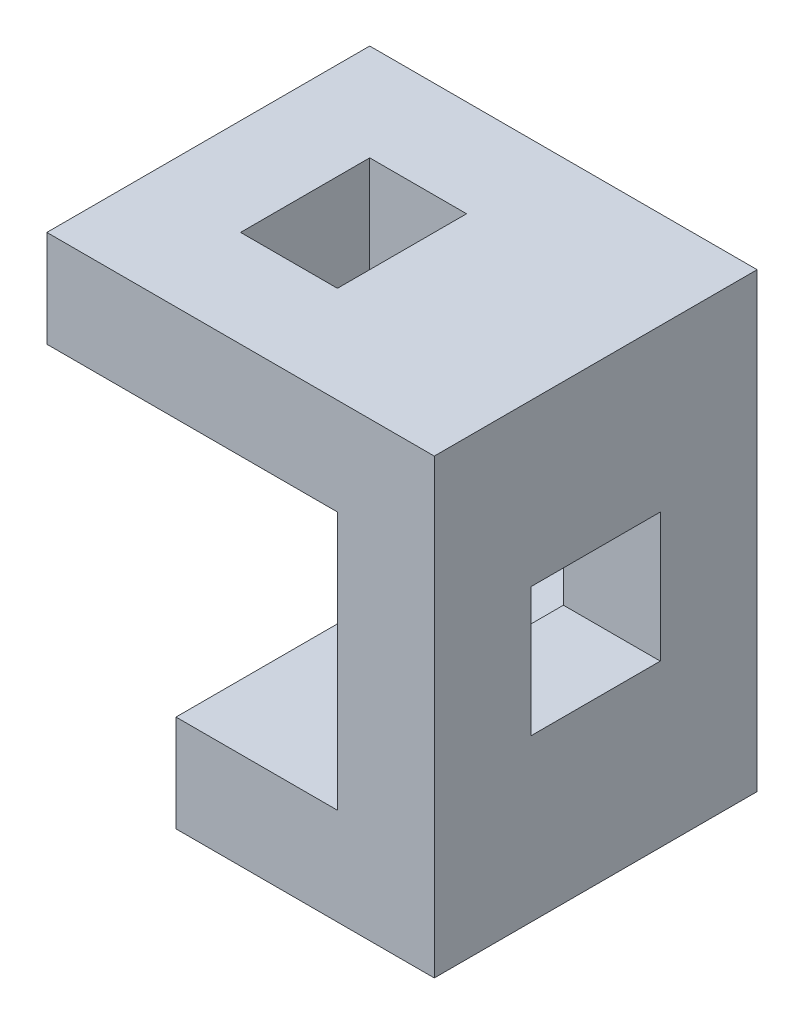
ISO-10303-21;
HEADER;
FILE_DESCRIPTION(('STEP AP214'),'2;1');
FILE_NAME('part.step','',(''),(''),'','','');
FILE_SCHEMA(('AUTOMOTIVE_DESIGN { 1 0 10303 214 1 1 1 1 }'));
ENDSEC;
DATA;
#1=APPLICATION_CONTEXT('core data for automotive mechanical design processes');
#2=APPLICATION_PROTOCOL_DEFINITION('international standard','automotive_design',2000,#1);
#3=PRODUCT_CONTEXT('',#1,'mechanical');
#4=PRODUCT('Part','Part','',(#3));
#5=PRODUCT_RELATED_PRODUCT_CATEGORY('part','',(#4));
#6=PRODUCT_DEFINITION_FORMATION('','',#4);
#7=PRODUCT_DEFINITION_CONTEXT('part definition',#1,'design');
#8=PRODUCT_DEFINITION('design','',#6,#7);
#9=PRODUCT_DEFINITION_SHAPE('','',#8);
#10=(LENGTH_UNIT() NAMED_UNIT(*) SI_UNIT(.MILLI.,.METRE.));
#11=(NAMED_UNIT(*) PLANE_ANGLE_UNIT() SI_UNIT($,.RADIAN.));
#12=(NAMED_UNIT(*) SI_UNIT($,.STERADIAN.) SOLID_ANGLE_UNIT());
#13=UNCERTAINTY_MEASURE_WITH_UNIT(LENGTH_MEASURE(1.E-05),#10,'distance_accuracy_value','');
#14=(GEOMETRIC_REPRESENTATION_CONTEXT(3) GLOBAL_UNCERTAINTY_ASSIGNED_CONTEXT((#13)) GLOBAL_UNIT_ASSIGNED_CONTEXT((#10,
#11,#12)) REPRESENTATION_CONTEXT('',''));
#15=CARTESIAN_POINT('',(0.,0.,0.));
#16=DIRECTION('',(0.,0.,1.));
#17=DIRECTION('',(1.,0.,0.));
#18=AXIS2_PLACEMENT_3D('',#15,#16,#17);
#19=CARTESIAN_POINT('',(-60.,-15.,50.));
#20=DIRECTION('',(1.,0.,0.));
#21=DIRECTION('',(0.,0.,-1.));
#22=AXIS2_PLACEMENT_3D('',#19,#20,#21);
#23=PLANE('',#22);
#24=DIRECTION('',(0.,-1.,0.));
#25=VECTOR('',#24,1.);
#26=CARTESIAN_POINT('',(-60.,-15.,0.));
#27=LINE('',#26,#25);
#28=CARTESIAN_POINT('',(-60.,0.,0.));
#29=VERTEX_POINT('',#28);
#30=CARTESIAN_POINT('',(-60.,-15.,0.));
#31=VERTEX_POINT('',#30);
#32=EDGE_CURVE('E196',#29,#31,#27,.T.);
#33=ORIENTED_EDGE('',*,*,#32,.T.);
#34=DIRECTION('',(0.,0.,-1.));
#35=VECTOR('',#34,1.);
#36=CARTESIAN_POINT('',(-60.,-15.,50.));
#37=LINE('',#36,#35);
#38=CARTESIAN_POINT('',(-60.,-15.,50.));
#39=VERTEX_POINT('',#38);
#40=EDGE_CURVE('E257',#39,#31,#37,.T.);
#41=ORIENTED_EDGE('',*,*,#40,.F.);
#42=DIRECTION('',(0.,-1.,0.));
#43=VECTOR('',#42,1.);
#44=CARTESIAN_POINT('',(-60.,-15.,50.));
#45=LINE('',#44,#43);
#46=CARTESIAN_POINT('',(-60.,0.,50.));
#47=VERTEX_POINT('',#46);
#48=EDGE_CURVE('E203',#47,#39,#45,.T.);
#49=ORIENTED_EDGE('',*,*,#48,.F.);
#50=DIRECTION('',(0.,0.,-1.));
#51=VECTOR('',#50,1.);
#52=CARTESIAN_POINT('',(-60.,0.,50.));
#53=LINE('',#52,#51);
#54=EDGE_CURVE('E221',#47,#29,#53,.T.);
#55=ORIENTED_EDGE('',*,*,#54,.T.);
#56=EDGE_LOOP('',(#33,#41,#49,#55));
#57=FACE_BOUND('',#56,.T.);
#58=ADVANCED_FACE('F33',(#57),#23,.F.);
#59=CARTESIAN_POINT('',(-15.,-15.,50.));
#60=DIRECTION('',(0.,1.,0.));
#61=DIRECTION('',(-1.,0.,0.));
#62=AXIS2_PLACEMENT_3D('',#59,#60,#61);
#63=PLANE('',#62);
#64=DIRECTION('',(0.,0.,-1.));
#65=VECTOR('',#64,1.);
#66=CARTESIAN_POINT('',(-30.,-15.,50.));
#67=LINE('',#66,#65);
#68=CARTESIAN_POINT('',(-30.,-15.,35.));
#69=VERTEX_POINT('',#68);
#70=CARTESIAN_POINT('',(-30.,-15.,15.));
#71=VERTEX_POINT('',#70);
#72=EDGE_CURVE('E176',#69,#71,#67,.T.);
#73=ORIENTED_EDGE('',*,*,#72,.T.);
#74=DIRECTION('',(-1.,0.,0.));
#75=VECTOR('',#74,1.);
#76=CARTESIAN_POINT('',(-15.,-15.,15.));
#77=LINE('',#76,#75);
#78=CARTESIAN_POINT('',(-45.,-15.,15.));
#79=VERTEX_POINT('',#78);
#80=EDGE_CURVE('E179',#71,#79,#77,.T.);
#81=ORIENTED_EDGE('',*,*,#80,.T.);
#82=DIRECTION('',(0.,0.,1.));
#83=VECTOR('',#82,1.);
#84=CARTESIAN_POINT('',(-45.,-15.,50.));
#85=LINE('',#84,#83);
#86=CARTESIAN_POINT('',(-45.,-15.,35.));
#87=VERTEX_POINT('',#86);
#88=EDGE_CURVE('E171',#79,#87,#85,.T.);
#89=ORIENTED_EDGE('',*,*,#88,.T.);
#90=DIRECTION('',(1.,0.,0.));
#91=VECTOR('',#90,1.);
#92=CARTESIAN_POINT('',(-15.,-15.,35.));
#93=LINE('',#92,#91);
#94=EDGE_CURVE('E151',#87,#69,#93,.T.);
#95=ORIENTED_EDGE('',*,*,#94,.T.);
#96=EDGE_LOOP('',(#73,#81,#89,#95));
#97=FACE_BOUND('',#96,.T.);
#98=DIRECTION('',(1.,0.,0.));
#99=VECTOR('',#98,1.);
#100=CARTESIAN_POINT('',(-15.,-15.,0.));
#101=LINE('',#100,#99);
#102=CARTESIAN_POINT('',(-15.,-15.,0.));
#103=VERTEX_POINT('',#102);
#104=EDGE_CURVE('E224',#31,#103,#101,.T.);
#105=ORIENTED_EDGE('',*,*,#104,.T.);
#106=DIRECTION('',(0.,0.,-1.));
#107=VECTOR('',#106,1.);
#108=CARTESIAN_POINT('',(-15.,-15.,50.));
#109=LINE('',#108,#107);
#110=CARTESIAN_POINT('',(-15.,-15.,50.));
#111=VERTEX_POINT('',#110);
#112=EDGE_CURVE('E254',#111,#103,#109,.T.);
#113=ORIENTED_EDGE('',*,*,#112,.F.);
#114=DIRECTION('',(1.,0.,0.));
#115=VECTOR('',#114,1.);
#116=CARTESIAN_POINT('',(-15.,-15.,50.));
#117=LINE('',#116,#115);
#118=EDGE_CURVE('E206',#39,#111,#117,.T.);
#119=ORIENTED_EDGE('',*,*,#118,.F.);
#120=ORIENTED_EDGE('',*,*,#40,.T.);
#121=EDGE_LOOP('',(#105,#113,#119,#120));
#122=FACE_BOUND('',#121,.T.);
#123=ADVANCED_FACE('F300',(#97,#122),#63,.F.);
#124=CARTESIAN_POINT('',(-15.,-55.,50.));
#125=DIRECTION('',(1.,0.,0.));
#126=DIRECTION('',(0.,1.,0.));
#127=AXIS2_PLACEMENT_3D('',#124,#125,#126);
#128=PLANE('',#127);
#129=DIRECTION('',(0.,-1.,0.));
#130=VECTOR('',#129,1.);
#131=CARTESIAN_POINT('',(-15.,-25.,15.));
#132=LINE('',#131,#130);
#133=CARTESIAN_POINT('',(-15.,-25.,15.));
#134=VERTEX_POINT('',#133);
#135=CARTESIAN_POINT('',(-15.,-45.,15.));
#136=VERTEX_POINT('',#135);
#137=EDGE_CURVE('E184',#134,#136,#132,.T.);
#138=ORIENTED_EDGE('',*,*,#137,.F.);
#139=DIRECTION('',(0.,0.,-1.));
#140=VECTOR('',#139,1.);
#141=CARTESIAN_POINT('',(-15.,-25.,35.));
#142=LINE('',#141,#140);
#143=CARTESIAN_POINT('',(-15.,-25.,35.));
#144=VERTEX_POINT('',#143);
#145=EDGE_CURVE('E182',#144,#134,#142,.T.);
#146=ORIENTED_EDGE('',*,*,#145,.F.);
#147=DIRECTION('',(0.,1.,0.));
#148=VECTOR('',#147,1.);
#149=CARTESIAN_POINT('',(-15.,-45.,35.));
#150=LINE('',#149,#148);
#151=CARTESIAN_POINT('',(-15.,-45.,35.));
#152=VERTEX_POINT('',#151);
#153=EDGE_CURVE('E190',#152,#144,#150,.T.);
#154=ORIENTED_EDGE('',*,*,#153,.F.);
#155=DIRECTION('',(0.,0.,1.));
#156=VECTOR('',#155,1.);
#157=CARTESIAN_POINT('',(-15.,-45.,15.));
#158=LINE('',#157,#156);
#159=EDGE_CURVE('E187',#136,#152,#158,.T.);
#160=ORIENTED_EDGE('',*,*,#159,.F.);
#161=EDGE_LOOP('',(#138,#146,#154,#160));
#162=FACE_BOUND('',#161,.T.);
#163=DIRECTION('',(0.,-1.,0.));
#164=VECTOR('',#163,1.);
#165=CARTESIAN_POINT('',(-15.,-55.,0.));
#166=LINE('',#165,#164);
#167=CARTESIAN_POINT('',(-15.,-55.,0.));
#168=VERTEX_POINT('',#167);
#169=EDGE_CURVE('E226',#103,#168,#166,.T.);
#170=ORIENTED_EDGE('',*,*,#169,.T.);
#171=DIRECTION('',(0.,0.,-1.));
#172=VECTOR('',#171,1.);
#173=CARTESIAN_POINT('',(-15.,-55.,50.));
#174=LINE('',#173,#172);
#175=CARTESIAN_POINT('',(-15.,-55.,50.));
#176=VERTEX_POINT('',#175);
#177=EDGE_CURVE('E251',#176,#168,#174,.T.);
#178=ORIENTED_EDGE('',*,*,#177,.F.);
#179=DIRECTION('',(0.,-1.,0.));
#180=VECTOR('',#179,1.);
#181=CARTESIAN_POINT('',(-15.,-55.,50.));
#182=LINE('',#181,#180);
#183=EDGE_CURVE('E209',#111,#176,#182,.T.);
#184=ORIENTED_EDGE('',*,*,#183,.F.);
#185=ORIENTED_EDGE('',*,*,#112,.T.);
#186=EDGE_LOOP('',(#170,#178,#184,#185));
#187=FACE_BOUND('',#186,.T.);
#188=ADVANCED_FACE('F281',(#162,#187),#128,.F.);
#189=CARTESIAN_POINT('',(-40.,-55.,50.));
#190=DIRECTION('',(0.,-1.,0.));
#191=DIRECTION('',(0.,0.,-1.));
#192=AXIS2_PLACEMENT_3D('',#189,#190,#191);
#193=PLANE('',#192);
#194=DIRECTION('',(-1.,0.,0.));
#195=VECTOR('',#194,1.);
#196=CARTESIAN_POINT('',(-40.,-55.,0.));
#197=LINE('',#196,#195);
#198=CARTESIAN_POINT('',(-40.,-55.,0.));
#199=VERTEX_POINT('',#198);
#200=EDGE_CURVE('E228',#168,#199,#197,.T.);
#201=ORIENTED_EDGE('',*,*,#200,.T.);
#202=DIRECTION('',(0.,0.,-1.));
#203=VECTOR('',#202,1.);
#204=CARTESIAN_POINT('',(-40.,-55.,50.));
#205=LINE('',#204,#203);
#206=CARTESIAN_POINT('',(-40.,-55.,50.));
#207=VERTEX_POINT('',#206);
#208=EDGE_CURVE('E248',#207,#199,#205,.T.);
#209=ORIENTED_EDGE('',*,*,#208,.F.);
#210=DIRECTION('',(-1.,0.,0.));
#211=VECTOR('',#210,1.);
#212=CARTESIAN_POINT('',(-40.,-55.,50.));
#213=LINE('',#212,#211);
#214=EDGE_CURVE('E211',#176,#207,#213,.T.);
#215=ORIENTED_EDGE('',*,*,#214,.F.);
#216=ORIENTED_EDGE('',*,*,#177,.T.);
#217=EDGE_LOOP('',(#201,#209,#215,#216));
#218=FACE_BOUND('',#217,.T.);
#219=ADVANCED_FACE('F337',(#218),#193,.F.);
#220=CARTESIAN_POINT('',(-40.,-70.,50.));
#221=DIRECTION('',(1.,0.,0.));
#222=DIRECTION('',(0.,1.,0.));
#223=AXIS2_PLACEMENT_3D('',#220,#221,#222);
#224=PLANE('',#223);
#225=DIRECTION('',(0.,-1.,0.));
#226=VECTOR('',#225,1.);
#227=CARTESIAN_POINT('',(-40.,-70.,0.));
#228=LINE('',#227,#226);
#229=CARTESIAN_POINT('',(-40.,-70.,0.));
#230=VERTEX_POINT('',#229);
#231=EDGE_CURVE('E230',#199,#230,#228,.T.);
#232=ORIENTED_EDGE('',*,*,#231,.T.);
#233=DIRECTION('',(0.,0.,-1.));
#234=VECTOR('',#233,1.);
#235=CARTESIAN_POINT('',(-40.,-70.,50.));
#236=LINE('',#235,#234);
#237=CARTESIAN_POINT('',(-40.,-70.,50.));
#238=VERTEX_POINT('',#237);
#239=EDGE_CURVE('E245',#238,#230,#236,.T.);
#240=ORIENTED_EDGE('',*,*,#239,.F.);
#241=DIRECTION('',(0.,-1.,0.));
#242=VECTOR('',#241,1.);
#243=CARTESIAN_POINT('',(-40.,-70.,50.));
#244=LINE('',#243,#242);
#245=EDGE_CURVE('E213',#207,#238,#244,.T.);
#246=ORIENTED_EDGE('',*,*,#245,.F.);
#247=ORIENTED_EDGE('',*,*,#208,.T.);
#248=EDGE_LOOP('',(#232,#240,#246,#247));
#249=FACE_BOUND('',#248,.T.);
#250=ADVANCED_FACE('F333',(#249),#224,.F.);
#251=CARTESIAN_POINT('',(0.,-70.,50.));
#252=DIRECTION('',(0.,1.,0.));
#253=DIRECTION('',(-1.,0.,0.));
#254=AXIS2_PLACEMENT_3D('',#251,#252,#253);
#255=PLANE('',#254);
#256=DIRECTION('',(1.,0.,0.));
#257=VECTOR('',#256,1.);
#258=CARTESIAN_POINT('',(0.,-70.,0.));
#259=LINE('',#258,#257);
#260=CARTESIAN_POINT('',(0.,-70.,0.));
#261=VERTEX_POINT('',#260);
#262=EDGE_CURVE('E232',#230,#261,#259,.T.);
#263=ORIENTED_EDGE('',*,*,#262,.T.);
#264=DIRECTION('',(0.,0.,-1.));
#265=VECTOR('',#264,1.);
#266=CARTESIAN_POINT('',(0.,-70.,50.));
#267=LINE('',#266,#265);
#268=CARTESIAN_POINT('',(0.,-70.,50.));
#269=VERTEX_POINT('',#268);
#270=EDGE_CURVE('E242',#269,#261,#267,.T.);
#271=ORIENTED_EDGE('',*,*,#270,.F.);
#272=DIRECTION('',(1.,0.,0.));
#273=VECTOR('',#272,1.);
#274=CARTESIAN_POINT('',(0.,-70.,50.));
#275=LINE('',#274,#273);
#276=EDGE_CURVE('E215',#238,#269,#275,.T.);
#277=ORIENTED_EDGE('',*,*,#276,.F.);
#278=ORIENTED_EDGE('',*,*,#239,.T.);
#279=EDGE_LOOP('',(#263,#271,#277,#278));
#280=FACE_BOUND('',#279,.T.);
#281=ADVANCED_FACE('F328',(#280),#255,.F.);
#282=CARTESIAN_POINT('',(0.,0.,50.));
#283=DIRECTION('',(-1.,0.,0.));
#284=DIRECTION('',(0.,-1.,0.));
#285=AXIS2_PLACEMENT_3D('',#282,#283,#284);
#286=PLANE('',#285);
#287=DIRECTION('',(0.,1.,0.));
#288=VECTOR('',#287,1.);
#289=CARTESIAN_POINT('',(0.,0.,35.));
#290=LINE('',#289,#288);
#291=CARTESIAN_POINT('',(0.,-45.,35.));
#292=VERTEX_POINT('',#291);
#293=CARTESIAN_POINT('',(0.,-25.,35.));
#294=VERTEX_POINT('',#293);
#295=EDGE_CURVE('E40',#292,#294,#290,.T.);
#296=ORIENTED_EDGE('',*,*,#295,.T.);
#297=DIRECTION('',(0.,0.,-1.));
#298=VECTOR('',#297,1.);
#299=CARTESIAN_POINT('',(0.,-25.,50.));
#300=LINE('',#299,#298);
#301=CARTESIAN_POINT('',(0.,-25.,15.));
#302=VERTEX_POINT('',#301);
#303=EDGE_CURVE('E11',#294,#302,#300,.T.);
#304=ORIENTED_EDGE('',*,*,#303,.T.);
#305=DIRECTION('',(0.,-1.,0.));
#306=VECTOR('',#305,1.);
#307=CARTESIAN_POINT('',(0.,0.,15.));
#308=LINE('',#307,#306);
#309=CARTESIAN_POINT('',(0.,-45.,15.));
#310=VERTEX_POINT('',#309);
#311=EDGE_CURVE('E260',#302,#310,#308,.T.);
#312=ORIENTED_EDGE('',*,*,#311,.T.);
#313=DIRECTION('',(0.,0.,1.));
#314=VECTOR('',#313,1.);
#315=CARTESIAN_POINT('',(0.,-45.,50.));
#316=LINE('',#315,#314);
#317=EDGE_CURVE('E263',#310,#292,#316,.T.);
#318=ORIENTED_EDGE('',*,*,#317,.T.);
#319=EDGE_LOOP('',(#296,#304,#312,#318));
#320=FACE_BOUND('',#319,.T.);
#321=DIRECTION('',(0.,1.,0.));
#322=VECTOR('',#321,1.);
#323=CARTESIAN_POINT('',(0.,0.,0.));
#324=LINE('',#323,#322);
#325=CARTESIAN_POINT('',(0.,0.,0.));
#326=VERTEX_POINT('',#325);
#327=EDGE_CURVE('E234',#261,#326,#324,.T.);
#328=ORIENTED_EDGE('',*,*,#327,.T.);
#329=DIRECTION('',(0.,0.,-1.));
#330=VECTOR('',#329,1.);
#331=CARTESIAN_POINT('',(0.,0.,50.));
#332=LINE('',#331,#330);
#333=CARTESIAN_POINT('',(0.,0.,50.));
#334=VERTEX_POINT('',#333);
#335=EDGE_CURVE('E239',#334,#326,#332,.T.);
#336=ORIENTED_EDGE('',*,*,#335,.F.);
#337=DIRECTION('',(0.,1.,0.));
#338=VECTOR('',#337,1.);
#339=CARTESIAN_POINT('',(0.,0.,50.));
#340=LINE('',#339,#338);
#341=EDGE_CURVE('E217',#269,#334,#340,.T.);
#342=ORIENTED_EDGE('',*,*,#341,.F.);
#343=ORIENTED_EDGE('',*,*,#270,.T.);
#344=EDGE_LOOP('',(#328,#336,#342,#343));
#345=FACE_BOUND('',#344,.T.);
#346=ADVANCED_FACE('F267',(#320,#345),#286,.F.);
#347=CARTESIAN_POINT('',(-60.,0.,50.));
#348=DIRECTION('',(0.,-1.,0.));
#349=DIRECTION('',(0.,0.,-1.));
#350=AXIS2_PLACEMENT_3D('',#347,#348,#349);
#351=PLANE('',#350);
#352=DIRECTION('',(0.,0.,1.));
#353=VECTOR('',#352,1.);
#354=CARTESIAN_POINT('',(-45.,0.,15.));
#355=LINE('',#354,#353);
#356=CARTESIAN_POINT('',(-45.,0.,15.));
#357=VERTEX_POINT('',#356);
#358=CARTESIAN_POINT('',(-45.,0.,35.));
#359=VERTEX_POINT('',#358);
#360=EDGE_CURVE('E157',#357,#359,#355,.T.);
#361=ORIENTED_EDGE('',*,*,#360,.F.);
#362=DIRECTION('',(-1.,0.,0.));
#363=VECTOR('',#362,1.);
#364=CARTESIAN_POINT('',(-30.,0.,15.));
#365=LINE('',#364,#363);
#366=CARTESIAN_POINT('',(-30.,0.,15.));
#367=VERTEX_POINT('',#366);
#368=EDGE_CURVE('E55',#367,#357,#365,.T.);
#369=ORIENTED_EDGE('',*,*,#368,.F.);
#370=DIRECTION('',(0.,0.,-1.));
#371=VECTOR('',#370,1.);
#372=CARTESIAN_POINT('',(-30.,0.,35.));
#373=LINE('',#372,#371);
#374=CARTESIAN_POINT('',(-30.,0.,35.));
#375=VERTEX_POINT('',#374);
#376=EDGE_CURVE('E164',#375,#367,#373,.T.);
#377=ORIENTED_EDGE('',*,*,#376,.F.);
#378=DIRECTION('',(1.,0.,0.));
#379=VECTOR('',#378,1.);
#380=CARTESIAN_POINT('',(-45.,0.,35.));
#381=LINE('',#380,#379);
#382=EDGE_CURVE('E148',#359,#375,#381,.T.);
#383=ORIENTED_EDGE('',*,*,#382,.F.);
#384=EDGE_LOOP('',(#361,#369,#377,#383));
#385=FACE_BOUND('',#384,.T.);
#386=DIRECTION('',(-1.,0.,0.));
#387=VECTOR('',#386,1.);
#388=CARTESIAN_POINT('',(-60.,0.,0.));
#389=LINE('',#388,#387);
#390=EDGE_CURVE('E207',#326,#29,#389,.T.);
#391=ORIENTED_EDGE('',*,*,#390,.T.);
#392=ORIENTED_EDGE('',*,*,#54,.F.);
#393=DIRECTION('',(-1.,0.,0.));
#394=VECTOR('',#393,1.);
#395=CARTESIAN_POINT('',(-60.,0.,50.));
#396=LINE('',#395,#394);
#397=EDGE_CURVE('E219',#334,#47,#396,.T.);
#398=ORIENTED_EDGE('',*,*,#397,.F.);
#399=ORIENTED_EDGE('',*,*,#335,.T.);
#400=EDGE_LOOP('',(#391,#392,#398,#399));
#401=FACE_BOUND('',#400,.T.);
#402=ADVANCED_FACE('F161',(#385,#401),#351,.F.);
#403=CARTESIAN_POINT('',(0.,0.,50.));
#404=DIRECTION('',(0.,0.,-1.));
#405=DIRECTION('',(-1.,0.,0.));
#406=AXIS2_PLACEMENT_3D('',#403,#404,#405);
#407=PLANE('',#406);
#408=ORIENTED_EDGE('',*,*,#48,.T.);
#409=ORIENTED_EDGE('',*,*,#118,.T.);
#410=ORIENTED_EDGE('',*,*,#183,.T.);
#411=ORIENTED_EDGE('',*,*,#214,.T.);
#412=ORIENTED_EDGE('',*,*,#245,.T.);
#413=ORIENTED_EDGE('',*,*,#276,.T.);
#414=ORIENTED_EDGE('',*,*,#341,.T.);
#415=ORIENTED_EDGE('',*,*,#397,.T.);
#416=EDGE_LOOP('',(#408,#409,#410,#411,#412,#413,#414,#415));
#417=FACE_BOUND('',#416,.T.);
#418=ADVANCED_FACE('F320',(#417),#407,.F.);
#419=CARTESIAN_POINT('',(0.,0.,0.));
#420=DIRECTION('',(0.,0.,-1.));
#421=DIRECTION('',(-1.,0.,0.));
#422=AXIS2_PLACEMENT_3D('',#419,#420,#421);
#423=PLANE('',#422);
#424=ORIENTED_EDGE('',*,*,#32,.F.);
#425=ORIENTED_EDGE('',*,*,#390,.F.);
#426=ORIENTED_EDGE('',*,*,#327,.F.);
#427=ORIENTED_EDGE('',*,*,#262,.F.);
#428=ORIENTED_EDGE('',*,*,#231,.F.);
#429=ORIENTED_EDGE('',*,*,#200,.F.);
#430=ORIENTED_EDGE('',*,*,#169,.F.);
#431=ORIENTED_EDGE('',*,*,#104,.F.);
#432=EDGE_LOOP('',(#424,#425,#426,#427,#428,#429,#430,#431));
#433=FACE_BOUND('',#432,.T.);
#434=ADVANCED_FACE('F312',(#433),#423,.T.);
#435=CARTESIAN_POINT('',(35.,-25.,35.));
#436=DIRECTION('',(0.,1.,0.));
#437=DIRECTION('',(-1.,0.,0.));
#438=AXIS2_PLACEMENT_3D('',#435,#436,#437);
#439=PLANE('',#438);
#440=DIRECTION('',(-1.,0.,0.));
#441=VECTOR('',#440,1.);
#442=CARTESIAN_POINT('',(35.,-25.,35.));
#443=LINE('',#442,#441);
#444=EDGE_CURVE('E194',#294,#144,#443,.T.);
#445=ORIENTED_EDGE('',*,*,#444,.T.);
#446=ORIENTED_EDGE('',*,*,#145,.T.);
#447=DIRECTION('',(-1.,0.,0.));
#448=VECTOR('',#447,1.);
#449=CARTESIAN_POINT('',(35.,-25.,15.));
#450=LINE('',#449,#448);
#451=EDGE_CURVE('E193',#302,#134,#450,.T.);
#452=ORIENTED_EDGE('',*,*,#451,.F.);
#453=ORIENTED_EDGE('',*,*,#303,.F.);
#454=EDGE_LOOP('',(#445,#446,#452,#453));
#455=FACE_BOUND('',#454,.T.);
#456=ADVANCED_FACE('F285',(#455),#439,.F.);
#457=CARTESIAN_POINT('',(35.,-45.,35.));
#458=DIRECTION('',(0.,0.,1.));
#459=DIRECTION('',(1.,0.,0.));
#460=AXIS2_PLACEMENT_3D('',#457,#458,#459);
#461=PLANE('',#460);
#462=DIRECTION('',(-1.,0.,0.));
#463=VECTOR('',#462,1.);
#464=CARTESIAN_POINT('',(35.,-45.,35.));
#465=LINE('',#464,#463);
#466=EDGE_CURVE('E197',#292,#152,#465,.T.);
#467=ORIENTED_EDGE('',*,*,#466,.T.);
#468=ORIENTED_EDGE('',*,*,#153,.T.);
#469=ORIENTED_EDGE('',*,*,#444,.F.);
#470=ORIENTED_EDGE('',*,*,#295,.F.);
#471=EDGE_LOOP('',(#467,#468,#469,#470));
#472=FACE_BOUND('',#471,.T.);
#473=ADVANCED_FACE('F273',(#472),#461,.F.);
#474=CARTESIAN_POINT('',(35.,-45.,15.));
#475=DIRECTION('',(0.,-1.,0.));
#476=DIRECTION('',(1.,0.,0.));
#477=AXIS2_PLACEMENT_3D('',#474,#475,#476);
#478=PLANE('',#477);
#479=DIRECTION('',(-1.,0.,0.));
#480=VECTOR('',#479,1.);
#481=CARTESIAN_POINT('',(35.,-45.,15.));
#482=LINE('',#481,#480);
#483=EDGE_CURVE('E199',#310,#136,#482,.T.);
#484=ORIENTED_EDGE('',*,*,#483,.T.);
#485=ORIENTED_EDGE('',*,*,#159,.T.);
#486=ORIENTED_EDGE('',*,*,#466,.F.);
#487=ORIENTED_EDGE('',*,*,#317,.F.);
#488=EDGE_LOOP('',(#484,#485,#486,#487));
#489=FACE_BOUND('',#488,.T.);
#490=ADVANCED_FACE('F275',(#489),#478,.F.);
#491=CARTESIAN_POINT('',(35.,-25.,15.));
#492=DIRECTION('',(0.,0.,-1.));
#493=DIRECTION('',(0.,1.,0.));
#494=AXIS2_PLACEMENT_3D('',#491,#492,#493);
#495=PLANE('',#494);
#496=ORIENTED_EDGE('',*,*,#451,.T.);
#497=ORIENTED_EDGE('',*,*,#137,.T.);
#498=ORIENTED_EDGE('',*,*,#483,.F.);
#499=ORIENTED_EDGE('',*,*,#311,.F.);
#500=EDGE_LOOP('',(#496,#497,#498,#499));
#501=FACE_BOUND('',#500,.T.);
#502=ADVANCED_FACE('F287',(#501),#495,.F.);
#503=CARTESIAN_POINT('',(-30.,-50.,15.));
#504=DIRECTION('',(0.,0.,-1.));
#505=DIRECTION('',(-1.,0.,0.));
#506=AXIS2_PLACEMENT_3D('',#503,#504,#505);
#507=PLANE('',#506);
#508=DIRECTION('',(0.,1.,0.));
#509=VECTOR('',#508,1.);
#510=CARTESIAN_POINT('',(-30.,-50.,15.));
#511=LINE('',#510,#509);
#512=EDGE_CURVE('E169',#71,#367,#511,.T.);
#513=ORIENTED_EDGE('',*,*,#512,.T.);
#514=ORIENTED_EDGE('',*,*,#368,.T.);
#515=DIRECTION('',(0.,1.,0.));
#516=VECTOR('',#515,1.);
#517=CARTESIAN_POINT('',(-45.,-50.,15.));
#518=LINE('',#517,#516);
#519=EDGE_CURVE('E154',#79,#357,#518,.T.);
#520=ORIENTED_EDGE('',*,*,#519,.F.);
#521=ORIENTED_EDGE('',*,*,#80,.F.);
#522=EDGE_LOOP('',(#513,#514,#520,#521));
#523=FACE_BOUND('',#522,.T.);
#524=ADVANCED_FACE('F289',(#523),#507,.F.);
#525=CARTESIAN_POINT('',(-30.,-50.,35.));
#526=DIRECTION('',(1.,0.,0.));
#527=DIRECTION('',(0.,0.,-1.));
#528=AXIS2_PLACEMENT_3D('',#525,#526,#527);
#529=PLANE('',#528);
#530=DIRECTION('',(0.,1.,0.));
#531=VECTOR('',#530,1.);
#532=CARTESIAN_POINT('',(-30.,-50.,35.));
#533=LINE('',#532,#531);
#534=EDGE_CURVE('E153',#69,#375,#533,.T.);
#535=ORIENTED_EDGE('',*,*,#534,.T.);
#536=ORIENTED_EDGE('',*,*,#376,.T.);
#537=ORIENTED_EDGE('',*,*,#512,.F.);
#538=ORIENTED_EDGE('',*,*,#72,.F.);
#539=EDGE_LOOP('',(#535,#536,#537,#538));
#540=FACE_BOUND('',#539,.T.);
#541=ADVANCED_FACE('F295',(#540),#529,.F.);
#542=CARTESIAN_POINT('',(-45.,-50.,35.));
#543=DIRECTION('',(0.,0.,1.));
#544=DIRECTION('',(1.,0.,0.));
#545=AXIS2_PLACEMENT_3D('',#542,#543,#544);
#546=PLANE('',#545);
#547=DIRECTION('',(0.,1.,0.));
#548=VECTOR('',#547,1.);
#549=CARTESIAN_POINT('',(-45.,-50.,35.));
#550=LINE('',#549,#548);
#551=EDGE_CURVE('E47',#87,#359,#550,.T.);
#552=ORIENTED_EDGE('',*,*,#551,.T.);
#553=ORIENTED_EDGE('',*,*,#382,.T.);
#554=ORIENTED_EDGE('',*,*,#534,.F.);
#555=ORIENTED_EDGE('',*,*,#94,.F.);
#556=EDGE_LOOP('',(#552,#553,#554,#555));
#557=FACE_BOUND('',#556,.T.);
#558=ADVANCED_FACE('F145',(#557),#546,.F.);
#559=CARTESIAN_POINT('',(-45.,-50.,15.));
#560=DIRECTION('',(-1.,0.,0.));
#561=DIRECTION('',(0.,0.,1.));
#562=AXIS2_PLACEMENT_3D('',#559,#560,#561);
#563=PLANE('',#562);
#564=ORIENTED_EDGE('',*,*,#519,.T.);
#565=ORIENTED_EDGE('',*,*,#360,.T.);
#566=ORIENTED_EDGE('',*,*,#551,.F.);
#567=ORIENTED_EDGE('',*,*,#88,.F.);
#568=EDGE_LOOP('',(#564,#565,#566,#567));
#569=FACE_BOUND('',#568,.T.);
#570=ADVANCED_FACE('F158',(#569),#563,.F.);
#571=CLOSED_SHELL('',(#58,#123,#188,#219,#250,#281,#346,#402,#418,#434,#456,#473,#490,#502,#524,
#541,#558,#570));
#572=MANIFOLD_SOLID_BREP('B2',#571);
#573=ADVANCED_BREP_SHAPE_REPRESENTATION('',(#18,#572),#14);
#574=SHAPE_DEFINITION_REPRESENTATION(#9,#573);
ENDSEC;
END-ISO-10303-21;
